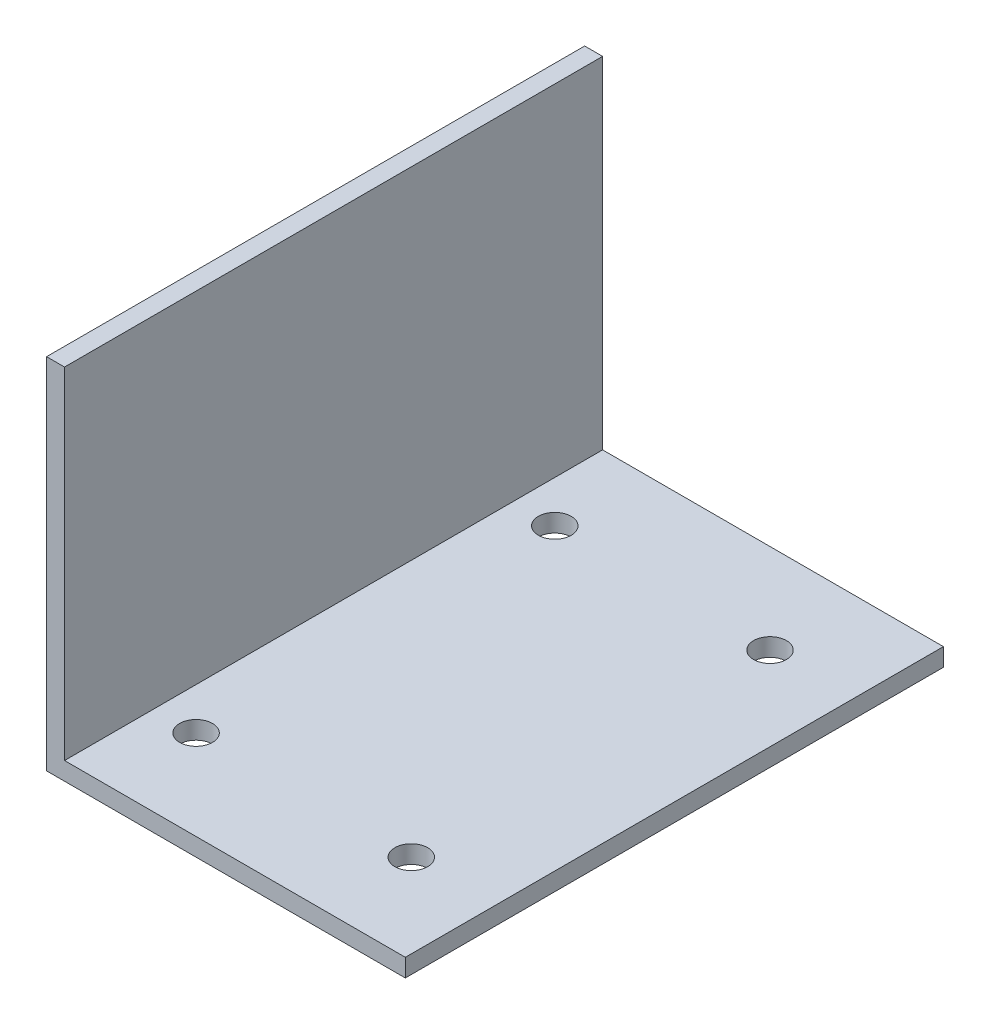
ISO-10303-21;
HEADER;
FILE_DESCRIPTION(('STEP AP214'),'2;1');
FILE_NAME('part.step','',(''),(''),'','','');
FILE_SCHEMA(('AUTOMOTIVE_DESIGN { 1 0 10303 214 1 1 1 1 }'));
ENDSEC;
DATA;
#1=APPLICATION_CONTEXT('core data for automotive mechanical design processes');
#2=APPLICATION_PROTOCOL_DEFINITION('international standard','automotive_design',2000,#1);
#3=PRODUCT_CONTEXT('',#1,'mechanical');
#4=PRODUCT('Part','Part','',(#3));
#5=PRODUCT_RELATED_PRODUCT_CATEGORY('part','',(#4));
#6=PRODUCT_DEFINITION_FORMATION('','',#4);
#7=PRODUCT_DEFINITION_CONTEXT('part definition',#1,'design');
#8=PRODUCT_DEFINITION('design','',#6,#7);
#9=PRODUCT_DEFINITION_SHAPE('','',#8);
#10=(LENGTH_UNIT() NAMED_UNIT(*) SI_UNIT(.MILLI.,.METRE.));
#11=(NAMED_UNIT(*) PLANE_ANGLE_UNIT() SI_UNIT($,.RADIAN.));
#12=(NAMED_UNIT(*) SI_UNIT($,.STERADIAN.) SOLID_ANGLE_UNIT());
#13=UNCERTAINTY_MEASURE_WITH_UNIT(LENGTH_MEASURE(1.E-05),#10,'distance_accuracy_value','');
#14=(GEOMETRIC_REPRESENTATION_CONTEXT(3) GLOBAL_UNCERTAINTY_ASSIGNED_CONTEXT((#13)) GLOBAL_UNIT_ASSIGNED_CONTEXT((#10,
#11,#12)) REPRESENTATION_CONTEXT('',''));
#15=CARTESIAN_POINT('',(0.,0.,0.));
#16=DIRECTION('',(0.,0.,1.));
#17=DIRECTION('',(1.,0.,0.));
#18=AXIS2_PLACEMENT_3D('',#15,#16,#17);
#19=CARTESIAN_POINT('',(60.,0.,90.));
#20=DIRECTION('',(0.,1.,0.));
#21=DIRECTION('',(-1.,0.,0.));
#22=AXIS2_PLACEMENT_3D('',#19,#20,#21);
#23=PLANE('',#22);
#24=CARTESIAN_POINT('',(10.,0.,15.));
#25=DIRECTION('',(0.,-1.,0.));
#26=DIRECTION('',(1.,0.,0.));
#27=AXIS2_PLACEMENT_3D('',#24,#25,#26);
#28=CIRCLE('',#27,2.75);
#29=CARTESIAN_POINT('',(12.75,0.,15.));
#30=VERTEX_POINT('',#29);
#31=EDGE_CURVE('E155',#30,#30,#28,.T.);
#32=ORIENTED_EDGE('',*,*,#31,.F.);
#33=EDGE_LOOP('',(#32));
#34=FACE_BOUND('',#33,.T.);
#35=CARTESIAN_POINT('',(46.,0.,15.));
#36=DIRECTION('',(0.,-1.,0.));
#37=DIRECTION('',(1.,0.,0.));
#38=AXIS2_PLACEMENT_3D('',#35,#36,#37);
#39=CIRCLE('',#38,2.75);
#40=CARTESIAN_POINT('',(48.75,0.,15.));
#41=VERTEX_POINT('',#40);
#42=EDGE_CURVE('E145',#41,#41,#39,.T.);
#43=ORIENTED_EDGE('',*,*,#42,.F.);
#44=EDGE_LOOP('',(#43));
#45=FACE_BOUND('',#44,.T.);
#46=CARTESIAN_POINT('',(46.,0.,75.));
#47=DIRECTION('',(0.,-1.,0.));
#48=DIRECTION('',(1.,0.,0.));
#49=AXIS2_PLACEMENT_3D('',#46,#47,#48);
#50=CIRCLE('',#49,2.75);
#51=CARTESIAN_POINT('',(48.75,0.,75.));
#52=VERTEX_POINT('',#51);
#53=EDGE_CURVE('E142',#52,#52,#50,.T.);
#54=ORIENTED_EDGE('',*,*,#53,.F.);
#55=EDGE_LOOP('',(#54));
#56=FACE_BOUND('',#55,.T.);
#57=CARTESIAN_POINT('',(10.,0.,75.));
#58=DIRECTION('',(0.,-1.,0.));
#59=DIRECTION('',(1.,0.,0.));
#60=AXIS2_PLACEMENT_3D('',#57,#58,#59);
#61=CIRCLE('',#60,2.75);
#62=CARTESIAN_POINT('',(12.75,0.,75.));
#63=VERTEX_POINT('',#62);
#64=EDGE_CURVE('E139',#63,#63,#61,.T.);
#65=ORIENTED_EDGE('',*,*,#64,.F.);
#66=EDGE_LOOP('',(#65));
#67=FACE_BOUND('',#66,.T.);
#68=DIRECTION('',(1.,0.,0.));
#69=VECTOR('',#68,1.);
#70=CARTESIAN_POINT('',(60.,0.,0.));
#71=LINE('',#70,#69);
#72=CARTESIAN_POINT('',(0.,0.,0.));
#73=VERTEX_POINT('',#72);
#74=CARTESIAN_POINT('',(60.,0.,0.));
#75=VERTEX_POINT('',#74);
#76=EDGE_CURVE('E120',#73,#75,#71,.T.);
#77=ORIENTED_EDGE('',*,*,#76,.T.);
#78=DIRECTION('',(0.,0.,-1.));
#79=VECTOR('',#78,1.);
#80=CARTESIAN_POINT('',(60.,0.,90.));
#81=LINE('',#80,#79);
#82=CARTESIAN_POINT('',(60.,0.,90.));
#83=VERTEX_POINT('',#82);
#84=EDGE_CURVE('E11',#83,#75,#81,.T.);
#85=ORIENTED_EDGE('',*,*,#84,.F.);
#86=DIRECTION('',(1.,0.,0.));
#87=VECTOR('',#86,1.);
#88=CARTESIAN_POINT('',(60.,0.,90.));
#89=LINE('',#88,#87);
#90=CARTESIAN_POINT('',(0.,0.,90.));
#91=VERTEX_POINT('',#90);
#92=EDGE_CURVE('E131',#91,#83,#89,.T.);
#93=ORIENTED_EDGE('',*,*,#92,.F.);
#94=DIRECTION('',(0.,0.,-1.));
#95=VECTOR('',#94,1.);
#96=CARTESIAN_POINT('',(0.,0.,90.));
#97=LINE('',#96,#95);
#98=EDGE_CURVE('E116',#91,#73,#97,.T.);
#99=ORIENTED_EDGE('',*,*,#98,.T.);
#100=EDGE_LOOP('',(#77,#85,#93,#99));
#101=FACE_BOUND('',#100,.T.);
#102=ADVANCED_FACE('F34',(#34,#45,#56,#67,#101),#23,.F.);
#103=CARTESIAN_POINT('',(60.,3.,90.));
#104=DIRECTION('',(-1.,0.,0.));
#105=DIRECTION('',(0.,0.,1.));
#106=AXIS2_PLACEMENT_3D('',#103,#104,#105);
#107=PLANE('',#106);
#108=DIRECTION('',(0.,1.,0.));
#109=VECTOR('',#108,1.);
#110=CARTESIAN_POINT('',(60.,3.,0.));
#111=LINE('',#110,#109);
#112=CARTESIAN_POINT('',(60.,3.,0.));
#113=VERTEX_POINT('',#112);
#114=EDGE_CURVE('E123',#75,#113,#111,.T.);
#115=ORIENTED_EDGE('',*,*,#114,.T.);
#116=DIRECTION('',(0.,0.,-1.));
#117=VECTOR('',#116,1.);
#118=CARTESIAN_POINT('',(60.,3.,90.));
#119=LINE('',#118,#117);
#120=CARTESIAN_POINT('',(60.,3.,90.));
#121=VERTEX_POINT('',#120);
#122=EDGE_CURVE('E43',#121,#113,#119,.T.);
#123=ORIENTED_EDGE('',*,*,#122,.F.);
#124=DIRECTION('',(0.,1.,0.));
#125=VECTOR('',#124,1.);
#126=CARTESIAN_POINT('',(60.,3.,90.));
#127=LINE('',#126,#125);
#128=EDGE_CURVE('E89',#83,#121,#127,.T.);
#129=ORIENTED_EDGE('',*,*,#128,.F.);
#130=ORIENTED_EDGE('',*,*,#84,.T.);
#131=EDGE_LOOP('',(#115,#123,#129,#130));
#132=FACE_BOUND('',#131,.T.);
#133=ADVANCED_FACE('F163',(#132),#107,.F.);
#134=CARTESIAN_POINT('',(3.00000000000001,3.,90.));
#135=DIRECTION('',(0.,-1.,0.));
#136=DIRECTION('',(0.,0.,-1.));
#137=AXIS2_PLACEMENT_3D('',#134,#135,#136);
#138=PLANE('',#137);
#139=CARTESIAN_POINT('',(10.,3.,15.));
#140=DIRECTION('',(0.,-1.,0.));
#141=DIRECTION('',(0.,0.,-1.));
#142=AXIS2_PLACEMENT_3D('',#139,#140,#141);
#143=CIRCLE('',#142,2.75);
#144=CARTESIAN_POINT('',(10.,3.,12.25));
#145=VERTEX_POINT('',#144);
#146=EDGE_CURVE('E37',#145,#145,#143,.T.);
#147=ORIENTED_EDGE('',*,*,#146,.T.);
#148=EDGE_LOOP('',(#147));
#149=FACE_BOUND('',#148,.T.);
#150=CARTESIAN_POINT('',(46.,3.,15.));
#151=DIRECTION('',(0.,-1.,0.));
#152=DIRECTION('',(0.,0.,-1.));
#153=AXIS2_PLACEMENT_3D('',#150,#151,#152);
#154=CIRCLE('',#153,2.75);
#155=CARTESIAN_POINT('',(46.,3.,12.25));
#156=VERTEX_POINT('',#155);
#157=EDGE_CURVE('E143',#156,#156,#154,.T.);
#158=ORIENTED_EDGE('',*,*,#157,.T.);
#159=EDGE_LOOP('',(#158));
#160=FACE_BOUND('',#159,.T.);
#161=CARTESIAN_POINT('',(46.,3.,75.));
#162=DIRECTION('',(0.,-1.,0.));
#163=DIRECTION('',(0.,0.,-1.));
#164=AXIS2_PLACEMENT_3D('',#161,#162,#163);
#165=CIRCLE('',#164,2.75);
#166=CARTESIAN_POINT('',(46.,3.,72.25));
#167=VERTEX_POINT('',#166);
#168=EDGE_CURVE('E140',#167,#167,#165,.T.);
#169=ORIENTED_EDGE('',*,*,#168,.T.);
#170=EDGE_LOOP('',(#169));
#171=FACE_BOUND('',#170,.T.);
#172=CARTESIAN_POINT('',(10.,3.,75.));
#173=DIRECTION('',(0.,-1.,0.));
#174=DIRECTION('',(0.,0.,-1.));
#175=AXIS2_PLACEMENT_3D('',#172,#173,#174);
#176=CIRCLE('',#175,2.75);
#177=CARTESIAN_POINT('',(10.,3.,72.25));
#178=VERTEX_POINT('',#177);
#179=EDGE_CURVE('E124',#178,#178,#176,.T.);
#180=ORIENTED_EDGE('',*,*,#179,.T.);
#181=EDGE_LOOP('',(#180));
#182=FACE_BOUND('',#181,.T.);
#183=DIRECTION('',(-1.,0.,0.));
#184=VECTOR('',#183,1.);
#185=CARTESIAN_POINT('',(3.00000000000001,3.,0.));
#186=LINE('',#185,#184);
#187=CARTESIAN_POINT('',(3.00000000000001,3.,0.));
#188=VERTEX_POINT('',#187);
#189=EDGE_CURVE('E126',#113,#188,#186,.T.);
#190=ORIENTED_EDGE('',*,*,#189,.T.);
#191=DIRECTION('',(0.,0.,-1.));
#192=VECTOR('',#191,1.);
#193=CARTESIAN_POINT('',(3.00000000000001,3.,90.));
#194=LINE('',#193,#192);
#195=CARTESIAN_POINT('',(3.00000000000001,3.,90.));
#196=VERTEX_POINT('',#195);
#197=EDGE_CURVE('E111',#196,#188,#194,.T.);
#198=ORIENTED_EDGE('',*,*,#197,.F.);
#199=DIRECTION('',(-1.,0.,0.));
#200=VECTOR('',#199,1.);
#201=CARTESIAN_POINT('',(3.00000000000001,3.,90.));
#202=LINE('',#201,#200);
#203=EDGE_CURVE('E102',#121,#196,#202,.T.);
#204=ORIENTED_EDGE('',*,*,#203,.F.);
#205=ORIENTED_EDGE('',*,*,#122,.T.);
#206=EDGE_LOOP('',(#190,#198,#204,#205));
#207=FACE_BOUND('',#206,.T.);
#208=ADVANCED_FACE('F166',(#149,#160,#171,#182,#207),#138,.F.);
#209=CARTESIAN_POINT('',(3.,60.,90.));
#210=DIRECTION('',(-1.,0.,0.));
#211=DIRECTION('',(0.,-1.,0.));
#212=AXIS2_PLACEMENT_3D('',#209,#210,#211);
#213=PLANE('',#212);
#214=DIRECTION('',(0.,1.,0.));
#215=VECTOR('',#214,1.);
#216=CARTESIAN_POINT('',(3.,60.,0.));
#217=LINE('',#216,#215);
#218=CARTESIAN_POINT('',(3.,60.,0.));
#219=VERTEX_POINT('',#218);
#220=EDGE_CURVE('E110',#188,#219,#217,.T.);
#221=ORIENTED_EDGE('',*,*,#220,.T.);
#222=DIRECTION('',(0.,0.,-1.));
#223=VECTOR('',#222,1.);
#224=CARTESIAN_POINT('',(3.,60.,90.));
#225=LINE('',#224,#223);
#226=CARTESIAN_POINT('',(3.,60.,90.));
#227=VERTEX_POINT('',#226);
#228=EDGE_CURVE('E107',#227,#219,#225,.T.);
#229=ORIENTED_EDGE('',*,*,#228,.F.);
#230=DIRECTION('',(0.,1.,0.));
#231=VECTOR('',#230,1.);
#232=CARTESIAN_POINT('',(3.,60.,90.));
#233=LINE('',#232,#231);
#234=EDGE_CURVE('E96',#196,#227,#233,.T.);
#235=ORIENTED_EDGE('',*,*,#234,.F.);
#236=ORIENTED_EDGE('',*,*,#197,.T.);
#237=EDGE_LOOP('',(#221,#229,#235,#236));
#238=FACE_BOUND('',#237,.T.);
#239=ADVANCED_FACE('F108',(#238),#213,.F.);
#240=CARTESIAN_POINT('',(0.,60.,90.));
#241=DIRECTION('',(0.,-1.,0.));
#242=DIRECTION('',(0.,0.,-1.));
#243=AXIS2_PLACEMENT_3D('',#240,#241,#242);
#244=PLANE('',#243);
#245=DIRECTION('',(-1.,0.,0.));
#246=VECTOR('',#245,1.);
#247=CARTESIAN_POINT('',(0.,60.,0.));
#248=LINE('',#247,#246);
#249=CARTESIAN_POINT('',(0.,60.,0.));
#250=VERTEX_POINT('',#249);
#251=EDGE_CURVE('E75',#219,#250,#248,.T.);
#252=ORIENTED_EDGE('',*,*,#251,.T.);
#253=DIRECTION('',(0.,0.,-1.));
#254=VECTOR('',#253,1.);
#255=CARTESIAN_POINT('',(0.,60.,90.));
#256=LINE('',#255,#254);
#257=CARTESIAN_POINT('',(0.,60.,90.));
#258=VERTEX_POINT('',#257);
#259=EDGE_CURVE('E112',#258,#250,#256,.T.);
#260=ORIENTED_EDGE('',*,*,#259,.F.);
#261=DIRECTION('',(-1.,0.,0.));
#262=VECTOR('',#261,1.);
#263=CARTESIAN_POINT('',(0.,60.,90.));
#264=LINE('',#263,#262);
#265=EDGE_CURVE('E100',#227,#258,#264,.T.);
#266=ORIENTED_EDGE('',*,*,#265,.F.);
#267=ORIENTED_EDGE('',*,*,#228,.T.);
#268=EDGE_LOOP('',(#252,#260,#266,#267));
#269=FACE_BOUND('',#268,.T.);
#270=ADVANCED_FACE('F114',(#269),#244,.F.);
#271=CARTESIAN_POINT('',(0.,0.,90.));
#272=DIRECTION('',(1.,0.,0.));
#273=DIRECTION('',(0.,0.,-1.));
#274=AXIS2_PLACEMENT_3D('',#271,#272,#273);
#275=PLANE('',#274);
#276=DIRECTION('',(0.,-1.,0.));
#277=VECTOR('',#276,1.);
#278=CARTESIAN_POINT('',(0.,0.,0.));
#279=LINE('',#278,#277);
#280=EDGE_CURVE('E81',#250,#73,#279,.T.);
#281=ORIENTED_EDGE('',*,*,#280,.T.);
#282=ORIENTED_EDGE('',*,*,#98,.F.);
#283=DIRECTION('',(0.,-1.,0.));
#284=VECTOR('',#283,1.);
#285=CARTESIAN_POINT('',(0.,0.,90.));
#286=LINE('',#285,#284);
#287=EDGE_CURVE('E52',#258,#91,#286,.T.);
#288=ORIENTED_EDGE('',*,*,#287,.F.);
#289=ORIENTED_EDGE('',*,*,#259,.T.);
#290=EDGE_LOOP('',(#281,#282,#288,#289));
#291=FACE_BOUND('',#290,.T.);
#292=ADVANCED_FACE('F171',(#291),#275,.F.);
#293=CARTESIAN_POINT('',(0.,0.,90.));
#294=DIRECTION('',(0.,0.,-1.));
#295=DIRECTION('',(-1.,0.,0.));
#296=AXIS2_PLACEMENT_3D('',#293,#294,#295);
#297=PLANE('',#296);
#298=ORIENTED_EDGE('',*,*,#92,.T.);
#299=ORIENTED_EDGE('',*,*,#128,.T.);
#300=ORIENTED_EDGE('',*,*,#203,.T.);
#301=ORIENTED_EDGE('',*,*,#234,.T.);
#302=ORIENTED_EDGE('',*,*,#265,.T.);
#303=ORIENTED_EDGE('',*,*,#287,.T.);
#304=EDGE_LOOP('',(#298,#299,#300,#301,#302,#303));
#305=FACE_BOUND('',#304,.T.);
#306=ADVANCED_FACE('F98',(#305),#297,.F.);
#307=CARTESIAN_POINT('',(0.,0.,0.));
#308=DIRECTION('',(0.,0.,-1.));
#309=DIRECTION('',(-1.,0.,0.));
#310=AXIS2_PLACEMENT_3D('',#307,#308,#309);
#311=PLANE('',#310);
#312=ORIENTED_EDGE('',*,*,#76,.F.);
#313=ORIENTED_EDGE('',*,*,#280,.F.);
#314=ORIENTED_EDGE('',*,*,#251,.F.);
#315=ORIENTED_EDGE('',*,*,#220,.F.);
#316=ORIENTED_EDGE('',*,*,#189,.F.);
#317=ORIENTED_EDGE('',*,*,#114,.F.);
#318=EDGE_LOOP('',(#312,#313,#314,#315,#316,#317));
#319=FACE_BOUND('',#318,.T.);
#320=ADVANCED_FACE('F169',(#319),#311,.T.);
#321=CARTESIAN_POINT('',(10.,60.,75.));
#322=DIRECTION('',(0.,-1.,0.));
#323=DIRECTION('',(1.,0.,0.));
#324=AXIS2_PLACEMENT_3D('',#321,#322,#323);
#325=CYLINDRICAL_SURFACE('',#324,2.75);
#326=ORIENTED_EDGE('',*,*,#64,.T.);
#327=EDGE_LOOP('',(#326));
#328=FACE_BOUND('',#327,.T.);
#329=ORIENTED_EDGE('',*,*,#179,.F.);
#330=EDGE_LOOP('',(#329));
#331=FACE_BOUND('',#330,.T.);
#332=ADVANCED_FACE('F194',(#328,#331),#325,.F.);
#333=CARTESIAN_POINT('',(46.,60.,75.));
#334=DIRECTION('',(0.,-1.,0.));
#335=DIRECTION('',(1.,0.,0.));
#336=AXIS2_PLACEMENT_3D('',#333,#334,#335);
#337=CYLINDRICAL_SURFACE('',#336,2.75);
#338=ORIENTED_EDGE('',*,*,#53,.T.);
#339=EDGE_LOOP('',(#338));
#340=FACE_BOUND('',#339,.T.);
#341=ORIENTED_EDGE('',*,*,#168,.F.);
#342=EDGE_LOOP('',(#341));
#343=FACE_BOUND('',#342,.T.);
#344=ADVANCED_FACE('F197',(#340,#343),#337,.F.);
#345=CARTESIAN_POINT('',(46.,60.,15.));
#346=DIRECTION('',(0.,-1.,0.));
#347=DIRECTION('',(1.,0.,0.));
#348=AXIS2_PLACEMENT_3D('',#345,#346,#347);
#349=CYLINDRICAL_SURFACE('',#348,2.75);
#350=ORIENTED_EDGE('',*,*,#42,.T.);
#351=EDGE_LOOP('',(#350));
#352=FACE_BOUND('',#351,.T.);
#353=ORIENTED_EDGE('',*,*,#157,.F.);
#354=EDGE_LOOP('',(#353));
#355=FACE_BOUND('',#354,.T.);
#356=ADVANCED_FACE('F213',(#352,#355),#349,.F.);
#357=CARTESIAN_POINT('',(10.,60.,15.));
#358=DIRECTION('',(0.,-1.,0.));
#359=DIRECTION('',(1.,0.,0.));
#360=AXIS2_PLACEMENT_3D('',#357,#358,#359);
#361=CYLINDRICAL_SURFACE('',#360,2.75);
#362=ORIENTED_EDGE('',*,*,#31,.T.);
#363=EDGE_LOOP('',(#362));
#364=FACE_BOUND('',#363,.T.);
#365=ORIENTED_EDGE('',*,*,#146,.F.);
#366=EDGE_LOOP('',(#365));
#367=FACE_BOUND('',#366,.T.);
#368=ADVANCED_FACE('F219',(#364,#367),#361,.F.);
#369=CLOSED_SHELL('',(#102,#133,#208,#239,#270,#292,#306,#320,#332,#344,#356,#368));
#370=MANIFOLD_SOLID_BREP('B2',#369);
#371=ADVANCED_BREP_SHAPE_REPRESENTATION('',(#18,#370),#14);
#372=SHAPE_DEFINITION_REPRESENTATION(#9,#371);
ENDSEC;
END-ISO-10303-21;
